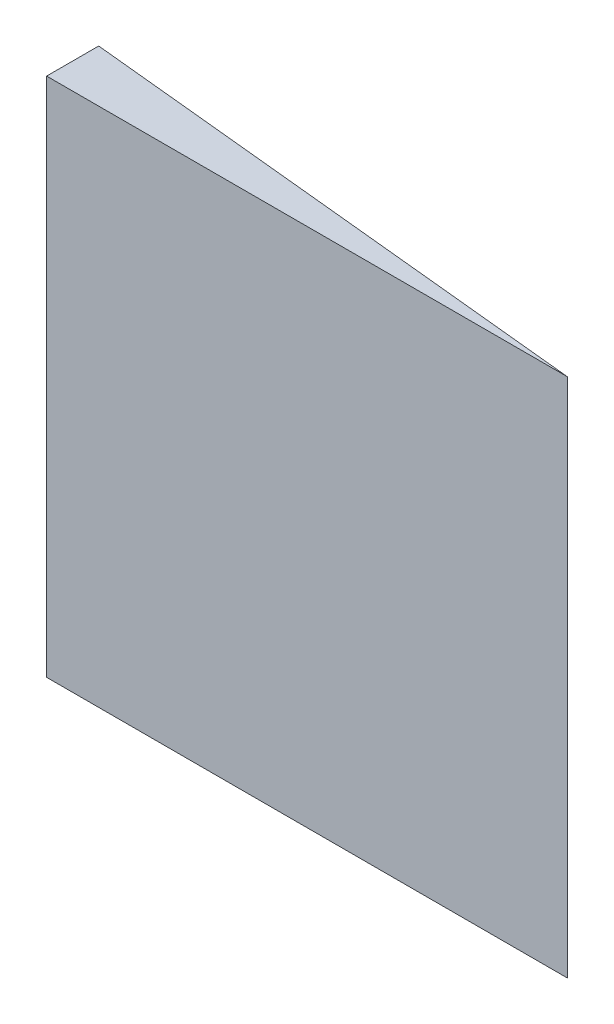
ISO-10303-21;
HEADER;
FILE_DESCRIPTION(('STEP AP214'),'2;1');
FILE_NAME('part.step','',(''),(''),'','','');
FILE_SCHEMA(('AUTOMOTIVE_DESIGN { 1 0 10303 214 1 1 1 1 }'));
ENDSEC;
DATA;
#1=APPLICATION_CONTEXT('core data for automotive mechanical design processes');
#2=APPLICATION_PROTOCOL_DEFINITION('international standard','automotive_design',2000,#1);
#3=PRODUCT_CONTEXT('',#1,'mechanical');
#4=PRODUCT('Part','Part','',(#3));
#5=PRODUCT_RELATED_PRODUCT_CATEGORY('part','',(#4));
#6=PRODUCT_DEFINITION_FORMATION('','',#4);
#7=PRODUCT_DEFINITION_CONTEXT('part definition',#1,'design');
#8=PRODUCT_DEFINITION('design','',#6,#7);
#9=PRODUCT_DEFINITION_SHAPE('','',#8);
#10=(LENGTH_UNIT() NAMED_UNIT(*) SI_UNIT(.MILLI.,.METRE.));
#11=(NAMED_UNIT(*) PLANE_ANGLE_UNIT() SI_UNIT($,.RADIAN.));
#12=(NAMED_UNIT(*) SI_UNIT($,.STERADIAN.) SOLID_ANGLE_UNIT());
#13=UNCERTAINTY_MEASURE_WITH_UNIT(LENGTH_MEASURE(1.E-05),#10,'distance_accuracy_value','');
#14=(GEOMETRIC_REPRESENTATION_CONTEXT(3) GLOBAL_UNCERTAINTY_ASSIGNED_CONTEXT((#13)) GLOBAL_UNIT_ASSIGNED_CONTEXT((#10,
#11,#12)) REPRESENTATION_CONTEXT('',''));
#15=CARTESIAN_POINT('',(0.,0.,0.));
#16=DIRECTION('',(0.,0.,1.));
#17=DIRECTION('',(1.,0.,0.));
#18=AXIS2_PLACEMENT_3D('',#15,#16,#17);
#19=CARTESIAN_POINT('',(0.,0.,0.));
#20=DIRECTION('',(0.,1.,0.));
#21=DIRECTION('',(0.,0.,1.));
#22=AXIS2_PLACEMENT_3D('',#19,#20,#21);
#23=PLANE('',#22);
#24=DIRECTION('',(-0.995037190209989,0.,-0.0995037190209989));
#25=VECTOR('',#24,1.);
#26=CARTESIAN_POINT('',(9.9009900990099,0.,-99.009900990099));
#27=LINE('',#26,#25);
#28=CARTESIAN_POINT('',(1000.,0.,0.));
#29=VERTEX_POINT('',#28);
#30=CARTESIAN_POINT('',(0.,0.,-100.));
#31=VERTEX_POINT('',#30);
#32=EDGE_CURVE('E106',#29,#31,#27,.T.);
#33=ORIENTED_EDGE('',*,*,#32,.F.);
#34=DIRECTION('',(1.,0.,0.));
#35=VECTOR('',#34,1.);
#36=CARTESIAN_POINT('',(0.,0.,0.));
#37=LINE('',#36,#35);
#38=CARTESIAN_POINT('',(0.,0.,0.));
#39=VERTEX_POINT('',#38);
#40=EDGE_CURVE('E92',#39,#29,#37,.T.);
#41=ORIENTED_EDGE('',*,*,#40,.F.);
#42=DIRECTION('',(0.,0.,1.));
#43=VECTOR('',#42,1.);
#44=CARTESIAN_POINT('',(0.,0.,0.));
#45=LINE('',#44,#43);
#46=EDGE_CURVE('E87',#31,#39,#45,.T.);
#47=ORIENTED_EDGE('',*,*,#46,.F.);
#48=EDGE_LOOP('',(#33,#41,#47));
#49=FACE_BOUND('',#48,.T.);
#50=ADVANCED_FACE('F58',(#49),#23,.F.);
#51=CARTESIAN_POINT('',(0.,1000.,0.));
#52=DIRECTION('',(0.,0.,-1.));
#53=DIRECTION('',(-1.,0.,0.));
#54=AXIS2_PLACEMENT_3D('',#51,#52,#53);
#55=PLANE('',#54);
#56=ORIENTED_EDGE('',*,*,#40,.T.);
#57=DIRECTION('',(0.,-1.,0.));
#58=VECTOR('',#57,1.);
#59=CARTESIAN_POINT('',(1000.,1000.,0.));
#60=LINE('',#59,#58);
#61=CARTESIAN_POINT('',(1000.,1000.,0.));
#62=VERTEX_POINT('',#61);
#63=EDGE_CURVE('E107',#62,#29,#60,.T.);
#64=ORIENTED_EDGE('',*,*,#63,.F.);
#65=DIRECTION('',(1.,0.,0.));
#66=VECTOR('',#65,1.);
#67=CARTESIAN_POINT('',(0.,1000.,0.));
#68=LINE('',#67,#66);
#69=CARTESIAN_POINT('',(0.,1000.,0.));
#70=VERTEX_POINT('',#69);
#71=EDGE_CURVE('E75',#70,#62,#68,.T.);
#72=ORIENTED_EDGE('',*,*,#71,.F.);
#73=DIRECTION('',(0.,-1.,0.));
#74=VECTOR('',#73,1.);
#75=CARTESIAN_POINT('',(0.,1000.,0.));
#76=LINE('',#75,#74);
#77=EDGE_CURVE('E67',#70,#39,#76,.T.);
#78=ORIENTED_EDGE('',*,*,#77,.T.);
#79=EDGE_LOOP('',(#56,#64,#72,#78));
#80=FACE_BOUND('',#79,.T.);
#81=ADVANCED_FACE('F114',(#80),#55,.F.);
#82=CARTESIAN_POINT('',(0.,1000.,0.));
#83=DIRECTION('',(1.,0.,0.));
#84=DIRECTION('',(0.,0.,-1.));
#85=AXIS2_PLACEMENT_3D('',#82,#83,#84);
#86=PLANE('',#85);
#87=ORIENTED_EDGE('',*,*,#46,.T.);
#88=ORIENTED_EDGE('',*,*,#77,.F.);
#89=DIRECTION('',(0.,0.,1.));
#90=VECTOR('',#89,1.);
#91=CARTESIAN_POINT('',(0.,1000.,0.));
#92=LINE('',#91,#90);
#93=CARTESIAN_POINT('',(0.,1000.,-100.));
#94=VERTEX_POINT('',#93);
#95=EDGE_CURVE('E95',#94,#70,#92,.T.);
#96=ORIENTED_EDGE('',*,*,#95,.F.);
#97=DIRECTION('',(0.,-1.,0.));
#98=VECTOR('',#97,1.);
#99=CARTESIAN_POINT('',(0.,1000.,-100.));
#100=LINE('',#99,#98);
#101=EDGE_CURVE('E12',#94,#31,#100,.T.);
#102=ORIENTED_EDGE('',*,*,#101,.T.);
#103=EDGE_LOOP('',(#87,#88,#96,#102));
#104=FACE_BOUND('',#103,.T.);
#105=ADVANCED_FACE('F96',(#104),#86,.F.);
#106=CARTESIAN_POINT('',(9.9009900990099,1000.,-99.009900990099));
#107=DIRECTION('',(-0.0995037190209989,0.,0.995037190209989));
#108=DIRECTION('',(0.995037190209989,0.,0.0995037190209989));
#109=AXIS2_PLACEMENT_3D('',#106,#107,#108);
#110=PLANE('',#109);
#111=ORIENTED_EDGE('',*,*,#32,.T.);
#112=ORIENTED_EDGE('',*,*,#101,.F.);
#113=DIRECTION('',(-0.995037190209989,0.,-0.0995037190209989));
#114=VECTOR('',#113,1.);
#115=CARTESIAN_POINT('',(9.9009900990099,1000.,-99.009900990099));
#116=LINE('',#115,#114);
#117=EDGE_CURVE('E99',#62,#94,#116,.T.);
#118=ORIENTED_EDGE('',*,*,#117,.F.);
#119=ORIENTED_EDGE('',*,*,#63,.T.);
#120=EDGE_LOOP('',(#111,#112,#118,#119));
#121=FACE_BOUND('',#120,.T.);
#122=ADVANCED_FACE('F60',(#121),#110,.F.);
#123=CARTESIAN_POINT('',(0.,1000.,0.));
#124=DIRECTION('',(0.,1.,0.));
#125=DIRECTION('',(0.,0.,1.));
#126=AXIS2_PLACEMENT_3D('',#123,#124,#125);
#127=PLANE('',#126);
#128=ORIENTED_EDGE('',*,*,#117,.T.);
#129=ORIENTED_EDGE('',*,*,#95,.T.);
#130=ORIENTED_EDGE('',*,*,#71,.T.);
#131=EDGE_LOOP('',(#128,#129,#130));
#132=FACE_BOUND('',#131,.T.);
#133=ADVANCED_FACE('F102',(#132),#127,.T.);
#134=CLOSED_SHELL('',(#50,#81,#105,#122,#133));
#135=MANIFOLD_SOLID_BREP('B2',#134);
#136=ADVANCED_BREP_SHAPE_REPRESENTATION('',(#18,#135),#14);
#137=SHAPE_DEFINITION_REPRESENTATION(#9,#136);
ENDSEC;
END-ISO-10303-21;
